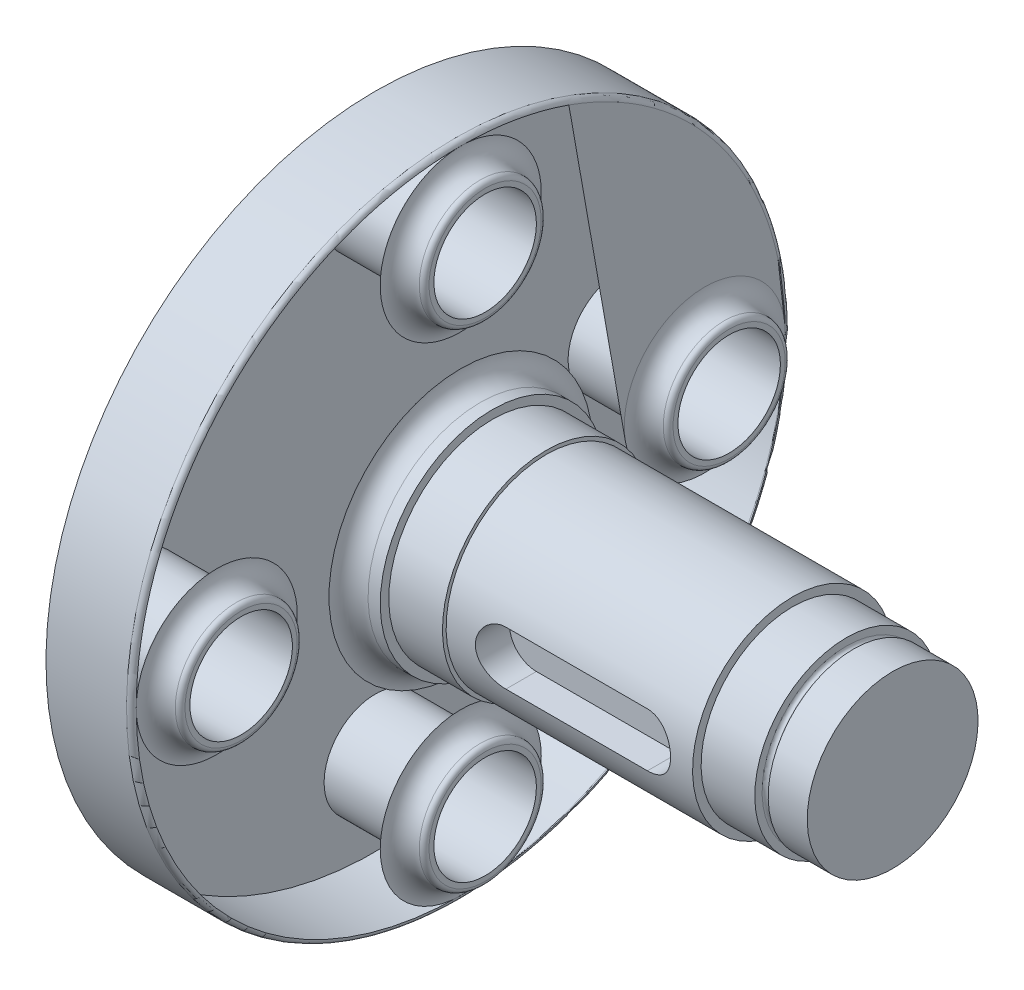
ISO-10303-21;
HEADER;
FILE_DESCRIPTION(('STEP AP214'),'2;1');
FILE_NAME('part.step','',(''),(''),'','','');
FILE_SCHEMA(('AUTOMOTIVE_DESIGN { 1 0 10303 214 1 1 1 1 }'));
ENDSEC;
DATA;
#1=APPLICATION_CONTEXT('core data for automotive mechanical design processes');
#2=APPLICATION_PROTOCOL_DEFINITION('international standard','automotive_design',2000,#1);
#3=PRODUCT_CONTEXT('',#1,'mechanical');
#4=PRODUCT('Part','Part','',(#3));
#5=PRODUCT_RELATED_PRODUCT_CATEGORY('part','',(#4));
#6=PRODUCT_DEFINITION_FORMATION('','',#4);
#7=PRODUCT_DEFINITION_CONTEXT('part definition',#1,'design');
#8=PRODUCT_DEFINITION('design','',#6,#7);
#9=PRODUCT_DEFINITION_SHAPE('','',#8);
#10=(LENGTH_UNIT() NAMED_UNIT(*) SI_UNIT(.MILLI.,.METRE.));
#11=(NAMED_UNIT(*) PLANE_ANGLE_UNIT() SI_UNIT($,.RADIAN.));
#12=(NAMED_UNIT(*) SI_UNIT($,.STERADIAN.) SOLID_ANGLE_UNIT());
#13=UNCERTAINTY_MEASURE_WITH_UNIT(LENGTH_MEASURE(1.E-05),#10,'distance_accuracy_value','');
#14=(GEOMETRIC_REPRESENTATION_CONTEXT(3) GLOBAL_UNCERTAINTY_ASSIGNED_CONTEXT((#13)) GLOBAL_UNIT_ASSIGNED_CONTEXT((#10,
#11,#12)) REPRESENTATION_CONTEXT('',''));
#15=CARTESIAN_POINT('',(0.,0.,0.));
#16=DIRECTION('',(0.,0.,1.));
#17=DIRECTION('',(1.,0.,0.));
#18=AXIS2_PLACEMENT_3D('',#15,#16,#17);
#19=CARTESIAN_POINT('',(333.387398458216,1.76597457780672E-13,0.));
#20=DIRECTION('',(1.,0.,0.));
#21=DIRECTION('',(0.,1.,0.));
#22=AXIS2_PLACEMENT_3D('',#19,#20,#21);
#23=CYLINDRICAL_SURFACE('',#22,40.9999999999999);
#24=CARTESIAN_POINT('',(70.,1.2822271466011E-13,0.));
#25=DIRECTION('',(1.,0.,0.));
#26=DIRECTION('',(0.,1.,0.));
#27=AXIS2_PLACEMENT_3D('',#24,#25,#26);
#28=CIRCLE('',#27,40.9999999999999);
#29=CARTESIAN_POINT('',(70.,41.,0.));
#30=VERTEX_POINT('',#29);
#31=EDGE_CURVE('E321',#30,#30,#28,.T.);
#32=ORIENTED_EDGE('',*,*,#31,.T.);
#33=EDGE_LOOP('',(#32));
#34=FACE_BOUND('',#33,.T.);
#35=CARTESIAN_POINT('',(171.,1.46772763310034E-13,0.));
#36=DIRECTION('',(1.,0.,0.));
#37=DIRECTION('',(0.,1.,0.));
#38=AXIS2_PLACEMENT_3D('',#35,#36,#37);
#39=CIRCLE('',#38,40.9999999999999);
#40=CARTESIAN_POINT('',(171.,41.,0.));
#41=VERTEX_POINT('',#40);
#42=EDGE_CURVE('E323',#41,#41,#39,.T.);
#43=ORIENTED_EDGE('',*,*,#42,.F.);
#44=EDGE_LOOP('',(#43));
#45=FACE_BOUND('',#44,.T.);
#46=DIRECTION('',(1.,0.,0.));
#47=VECTOR('',#46,1.);
#48=CARTESIAN_POINT('',(333.387398458216,-11.,39.4968353162628));
#49=LINE('',#48,#47);
#50=CARTESIAN_POINT('',(93.,-11.,39.4968353162628));
#51=VERTEX_POINT('',#50);
#52=CARTESIAN_POINT('',(151.,-11.,39.4968353162628));
#53=VERTEX_POINT('',#52);
#54=EDGE_CURVE('E129',#51,#53,#49,.T.);
#55=ORIENTED_EDGE('',*,*,#54,.F.);
#56=CARTESIAN_POINT('',(93.,11.,39.4968353162629));
#57=CARTESIAN_POINT('',(92.6965934766001,11.0000393756425,39.4967972893382));
#58=CARTESIAN_POINT('',(92.3932004049759,10.9874487441517,39.5003300911878));
#59=CARTESIAN_POINT('',(91.7886988532549,10.9372977716872,39.5142602703548));
#60=CARTESIAN_POINT('',(91.4875899555039,10.8997421125094,39.5246563605685));
#61=CARTESIAN_POINT('',(90.8904466820825,10.8000593047236,39.5520065632383));
#62=CARTESIAN_POINT('',(90.5944027244958,10.7379855749583,39.5689464166912));
#63=CARTESIAN_POINT('',(90.0088079242076,10.5898053255873,39.6088619348973));
#64=CARTESIAN_POINT('',(89.7192571981718,10.5036983745428,39.6318377080058));
#65=CARTESIAN_POINT('',(89.1487574976311,10.3081921121429,39.6831370091928));
#66=CARTESIAN_POINT('',(88.8678050419883,10.1988023737699,39.711458338845));
#67=CARTESIAN_POINT('',(88.3161318132296,9.95751253351193,39.7726467977459));
#68=CARTESIAN_POINT('',(88.0454149387084,9.82560395793506,39.8055156373071));
#69=CARTESIAN_POINT('',(87.5160861277036,9.54028719155936,39.8748599892475));
#70=CARTESIAN_POINT('',(87.2574728787174,9.386881339139,39.9113351092245));
#71=CARTESIAN_POINT('',(86.7538161899617,9.05954948710992,39.9869076109494));
#72=CARTESIAN_POINT('',(86.5087790431697,8.88561408638734,40.0260061904964));
#73=CARTESIAN_POINT('',(86.0285042179319,8.51425098267137,40.1066632600186));
#74=CARTESIAN_POINT('',(85.7936157615195,8.31637925248789,40.148257459482));
#75=CARTESIAN_POINT('',(85.3413404819344,7.90183501823265,40.2318988347704));
#76=CARTESIAN_POINT('',(85.1239462127466,7.6851705953231,40.2739458091489));
#77=CARTESIAN_POINT('',(84.7078365480413,7.23423794988307,40.3573833919097));
#78=CARTESIAN_POINT('',(84.5091318874403,6.99995974769147,40.3987736118575));
#79=CARTESIAN_POINT('',(84.1319427680088,6.51550217173159,40.4797296453314));
#80=CARTESIAN_POINT('',(83.953450735497,6.26532880910618,40.5192961388913));
#81=CARTESIAN_POINT('',(83.6150778199372,5.74636906421433,40.5961717572341));
#82=CARTESIAN_POINT('',(83.4555517241818,5.47734405395368,40.6334329930268));
#83=CARTESIAN_POINT('',(83.1597918974462,4.92626575670414,40.7039194528673));
#84=CARTESIAN_POINT('',(83.0235584978335,4.64421228444173,40.737144619495));
#85=CARTESIAN_POINT('',(82.7754961547534,4.06909977684511,40.7986033262812));
#86=CARTESIAN_POINT('',(82.6636628441299,3.77604272196828,40.8268377595148));
#87=CARTESIAN_POINT('',(82.4653135588754,3.18099501072235,40.8775050013636));
#88=CARTESIAN_POINT('',(82.3787969003188,2.87900459592939,40.8999379667026));
#89=CARTESIAN_POINT('',(82.2335430435084,2.27541584651143,40.9379016920219));
#90=CARTESIAN_POINT('',(82.1742088894407,1.97397040878766,40.9535802718439));
#91=CARTESIAN_POINT('',(82.0809401507517,1.36690623303855,40.9783337987087));
#92=CARTESIAN_POINT('',(82.0470052120153,1.06128755325691,40.9874088378178));
#93=CARTESIAN_POINT('',(82.0048407553519,0.44819400056801,40.9986964815983));
#94=CARTESIAN_POINT('',(81.9966080152517,0.140719365176638,41.0009099464754));
#95=CARTESIAN_POINT('',(82.0059136918872,-0.473809075616646,40.9984135339345));
#96=CARTESIAN_POINT('',(82.0234517368794,-0.780862887024994,40.9937037563843));
#97=CARTESIAN_POINT('',(82.0833618758795,-1.38442027606809,40.9777035095829));
#98=CARTESIAN_POINT('',(82.1250874355702,-1.68099285156159,40.9665844041265));
#99=CARTESIAN_POINT('',(82.2325022108406,-2.26945953859835,40.9382013285342));
#100=CARTESIAN_POINT('',(82.2981909475589,-2.56135374350881,40.9209374811901));
#101=CARTESIAN_POINT('',(82.4529955305255,-3.13846414067688,40.8807255588915));
#102=CARTESIAN_POINT('',(82.5421119661346,-3.42368016473767,40.8577773409385));
#103=CARTESIAN_POINT('',(82.7430690850665,-3.9855219460573,40.806803256049));
#104=CARTESIAN_POINT('',(82.8549101294878,-4.26214756673236,40.7787773084272));
#105=CARTESIAN_POINT('',(83.1016835471906,-4.80768548456516,40.7180823598488));
#106=CARTESIAN_POINT('',(83.2368323989115,-5.07649504221773,40.6853703674769));
#107=CARTESIAN_POINT('',(83.5285082627457,-5.60188873770017,40.6163646685476));
#108=CARTESIAN_POINT('',(83.6850426580487,-5.85846861188121,40.5800697262108));
#109=CARTESIAN_POINT('',(84.0183643506281,-6.35769629002247,40.5048568335427));
#110=CARTESIAN_POINT('',(84.1951510832411,-6.60034448213445,40.4659389563548));
#111=CARTESIAN_POINT('',(84.5678139869299,-7.07023073722229,40.3864906495515));
#112=CARTESIAN_POINT('',(84.7636905973246,-7.29746844534971,40.3459601828379));
#113=CARTESIAN_POINT('',(85.179674276135,-7.74196490037426,40.263068425597));
#114=CARTESIAN_POINT('',(85.4003461569795,-7.9586921137842,40.2206894381422));
#115=CARTESIAN_POINT('',(85.8591406738117,-8.37278888200139,40.1365300787406));
#116=CARTESIAN_POINT('',(86.0972579952022,-8.57016428967137,40.094749529084));
#117=CARTESIAN_POINT('',(86.5895730428972,-8.94438772318482,40.0129309261099));
#118=CARTESIAN_POINT('',(86.8437781199211,-9.12122625929041,39.9728936836441));
#119=CARTESIAN_POINT('',(87.3665036274435,-9.45301783094547,39.8957325501734));
#120=CARTESIAN_POINT('',(87.6350236128475,-9.60797154641541,39.858608568675));
#121=CARTESIAN_POINT('',(88.186506561747,-9.89584235130244,39.7881192026725));
#122=CARTESIAN_POINT('',(88.4695565783747,-10.0285996033267,39.7547815919242));
#123=CARTESIAN_POINT('',(89.0463961587097,-10.2696993904642,39.6931828752918));
#124=CARTESIAN_POINT('',(89.340185217083,-10.3780430726622,39.6649215309093));
#125=CARTESIAN_POINT('',(89.9360356488008,-10.569290750523,39.6143898036066));
#126=CARTESIAN_POINT('',(90.2380864838329,-10.6522256460243,39.5921121479722));
#127=CARTESIAN_POINT('',(90.8484378001238,-10.7920686165309,39.5542222182512));
#128=CARTESIAN_POINT('',(91.1567353000559,-10.8489888155309,39.5386068394763));
#129=CARTESIAN_POINT('',(91.7209296875923,-10.9283908479877,39.5167268198813));
#130=CARTESIAN_POINT('',(91.9761740314296,-10.9552498398284,39.5092789782629));
#131=CARTESIAN_POINT('',(92.487605360436,-10.9910488481806,39.4993279881873));
#132=CARTESIAN_POINT('',(92.7437902169168,-11.0000171312634,39.4968170397359));
#133=CARTESIAN_POINT('',(93.,-11.,39.4968353162628));
#134=B_SPLINE_CURVE_WITH_KNOTS('',3,(#56,#57,#58,#59,#60,#61,#62,#63,#64,#65,#66,#67,#68,#69,
#70,#71,#72,#73,#74,#75,#76,#77,#78,#79,#80,#81,#82,#83,#84,#85,#86,#87,#88,#89,#90,#91,#92,#93,
#94,#95,#96,#97,#98,#99,#100,#101,#102,#103,#104,#105,#106,#107,#108,#109,#110,#111,#112,#113,
#114,#115,#116,#117,#118,#119,#120,#121,#122,#123,#124,#125,#126,#127,#128,#129,#130,#131,#132,
#133),.UNSPECIFIED.,.F.,.F.,(4,2,2,2,2,2,2,2,2,2,2,2,2,2,2,2,2,2,2,2,2,2,2,2,2,2,2,2,2,2,2,2,2,
2,2,2,2,2,4),(0.,0.909917285293938,1.81966397811948,2.72743939448897,3.63523110808712,
4.54265029136338,5.4504116862655,6.35807441544285,7.26615441590694,8.19486991212238,
9.1231880070085,10.0520360930649,10.9805349795554,11.924320318682,12.8681190832072,
13.8117487867198,14.7553529958611,15.6771037362726,16.5988416254235,17.5204639556483,
18.4420729915999,19.3401143041974,20.2381376720237,21.1361836332127,22.0342438656505,
22.9411448300206,23.8483596897386,24.7555492611899,25.6627597148916,26.5982371026509,
27.5334306812067,28.4690546916543,29.4046496276154,30.3467159308625,31.2887379613846,
32.2296098015472,33.1700427057269,33.9396726741373,34.7080856932821),.UNSPECIFIED.);
#135=CARTESIAN_POINT('',(93.,10.9999999999999,39.4968353162629));
#136=VERTEX_POINT('',#135);
#137=EDGE_CURVE('E109',#136,#51,#134,.T.);
#138=ORIENTED_EDGE('',*,*,#137,.F.);
#139=DIRECTION('',(1.,0.,0.));
#140=VECTOR('',#139,1.);
#141=CARTESIAN_POINT('',(333.387398458216,11.,39.4968353162629));
#142=LINE('',#141,#140);
#143=CARTESIAN_POINT('',(151.,11.,39.4968353162629));
#144=VERTEX_POINT('',#143);
#145=EDGE_CURVE('E121',#144,#136,#142,.F.);
#146=ORIENTED_EDGE('',*,*,#145,.F.);
#147=CARTESIAN_POINT('',(151.,-11.,39.4968353162628));
#148=CARTESIAN_POINT('',(151.3034065234,-11.0000393756425,39.4967972893381));
#149=CARTESIAN_POINT('',(151.606799595024,-10.9874487441517,39.5003300911878));
#150=CARTESIAN_POINT('',(152.211301146745,-10.9372977716872,39.5142602703548));
#151=CARTESIAN_POINT('',(152.512410044496,-10.8997421125094,39.5246563605684));
#152=CARTESIAN_POINT('',(153.109553317918,-10.8000593047236,39.5520065632383));
#153=CARTESIAN_POINT('',(153.405597275504,-10.7379855749583,39.5689464166911));
#154=CARTESIAN_POINT('',(153.991192075792,-10.5898053255873,39.6088619348973));
#155=CARTESIAN_POINT('',(154.280742801828,-10.5036983745428,39.6318377080057));
#156=CARTESIAN_POINT('',(154.851242502369,-10.3081921121429,39.6831370091927));
#157=CARTESIAN_POINT('',(155.132194958012,-10.1988023737699,39.7114583388449));
#158=CARTESIAN_POINT('',(155.68386818677,-9.95751253351194,39.7726467977458));
#159=CARTESIAN_POINT('',(155.954585061292,-9.82560395793508,39.8055156373071));
#160=CARTESIAN_POINT('',(156.483913872296,-9.54028719155938,39.8748599892474));
#161=CARTESIAN_POINT('',(156.742527121283,-9.38688133913902,39.9113351092244));
#162=CARTESIAN_POINT('',(157.246183810038,-9.05954948710993,39.9869076109493));
#163=CARTESIAN_POINT('',(157.49122095683,-8.88561408638736,40.0260061904963));
#164=CARTESIAN_POINT('',(157.971495782068,-8.51425098267139,40.1066632600186));
#165=CARTESIAN_POINT('',(158.206384238481,-8.3163792524879,40.148257459482));
#166=CARTESIAN_POINT('',(158.658659518066,-7.90183501823266,40.2318988347703));
#167=CARTESIAN_POINT('',(158.876053787253,-7.68517059532312,40.2739458091488));
#168=CARTESIAN_POINT('',(159.292163451959,-7.23423794988309,40.3573833919096));
#169=CARTESIAN_POINT('',(159.49086811256,-6.99995974769148,40.3987736118575));
#170=CARTESIAN_POINT('',(159.868057231991,-6.5155021717316,40.4797296453313));
#171=CARTESIAN_POINT('',(160.046549264503,-6.2653288091062,40.5192961388913));
#172=CARTESIAN_POINT('',(160.384922180063,-5.74636906421436,40.596171757234));
#173=CARTESIAN_POINT('',(160.544448275818,-5.4773440539537,40.6334329930268));
#174=CARTESIAN_POINT('',(160.840208102554,-4.92626575670415,40.7039194528673));
#175=CARTESIAN_POINT('',(160.976441502167,-4.64421228444175,40.7371446194949));
#176=CARTESIAN_POINT('',(161.224503845247,-4.06909977684513,40.7986033262811));
#177=CARTESIAN_POINT('',(161.33633715587,-3.77604272196829,40.8268377595148));
#178=CARTESIAN_POINT('',(161.534686441125,-3.18099501072237,40.8775050013636));
#179=CARTESIAN_POINT('',(161.621203099681,-2.8790045959294,40.8999379667025));
#180=CARTESIAN_POINT('',(161.766456956492,-2.27541584651145,40.9379016920219));
#181=CARTESIAN_POINT('',(161.825791110559,-1.97397040878768,40.9535802718439));
#182=CARTESIAN_POINT('',(161.919059849248,-1.36690623303856,40.9783337987087));
#183=CARTESIAN_POINT('',(161.952994787985,-1.06128755325693,40.9874088378178));
#184=CARTESIAN_POINT('',(161.995159244648,-0.448194000568027,40.9986964815983));
#185=CARTESIAN_POINT('',(162.003391984748,-0.140719365176654,41.0009099464754));
#186=CARTESIAN_POINT('',(161.994086308113,0.473809075616631,40.9984135339345));
#187=CARTESIAN_POINT('',(161.976548263121,0.780862887024978,40.9937037563843));
#188=CARTESIAN_POINT('',(161.916638124121,1.38442027606808,40.9777035095829));
#189=CARTESIAN_POINT('',(161.87491256443,1.68099285156159,40.9665844041266));
#190=CARTESIAN_POINT('',(161.767497789159,2.26945953859834,40.9382013285342));
#191=CARTESIAN_POINT('',(161.701809052441,2.56135374350881,40.9209374811901));
#192=CARTESIAN_POINT('',(161.547004469475,3.13846414067688,40.8807255588915));
#193=CARTESIAN_POINT('',(161.457888033865,3.42368016473766,40.8577773409385));
#194=CARTESIAN_POINT('',(161.256930914934,3.98552194605729,40.8068032560491));
#195=CARTESIAN_POINT('',(161.145089870512,4.26214756673235,40.7787773084272));
#196=CARTESIAN_POINT('',(160.898316452809,4.80768548456515,40.7180823598488));
#197=CARTESIAN_POINT('',(160.763167601089,5.07649504221772,40.6853703674769));
#198=CARTESIAN_POINT('',(160.471491737254,5.60188873770015,40.6163646685476));
#199=CARTESIAN_POINT('',(160.314957341951,5.85846861188119,40.5800697262109));
#200=CARTESIAN_POINT('',(159.981635649372,6.35769629002245,40.5048568335428));
#201=CARTESIAN_POINT('',(159.804848916759,6.60034448213443,40.4659389563549));
#202=CARTESIAN_POINT('',(159.43218601307,7.07023073722228,40.3864906495515));
#203=CARTESIAN_POINT('',(159.236309402675,7.2974684453497,40.345960182838));
#204=CARTESIAN_POINT('',(158.820325723865,7.74196490037426,40.263068425597));
#205=CARTESIAN_POINT('',(158.599653843021,7.9586921137842,40.2206894381422));
#206=CARTESIAN_POINT('',(158.140859326188,8.37278888200137,40.1365300787407));
#207=CARTESIAN_POINT('',(157.902742004798,8.57016428967135,40.094749529084));
#208=CARTESIAN_POINT('',(157.410426957103,8.94438772318479,40.01293092611));
#209=CARTESIAN_POINT('',(157.156221880079,9.12122625929038,39.9728936836441));
#210=CARTESIAN_POINT('',(156.633496372557,9.45301783094545,39.8957325501735));
#211=CARTESIAN_POINT('',(156.364976387153,9.6079715464154,39.858608568675));
#212=CARTESIAN_POINT('',(155.813493438253,9.89584235130243,39.7881192026726));
#213=CARTESIAN_POINT('',(155.530443421625,10.0285996033266,39.7547815919243));
#214=CARTESIAN_POINT('',(154.95360384129,10.2696993904642,39.6931828752919));
#215=CARTESIAN_POINT('',(154.659814782917,10.3780430726622,39.6649215309094));
#216=CARTESIAN_POINT('',(154.063964351199,10.5692907505229,39.6143898036067));
#217=CARTESIAN_POINT('',(153.761913516167,10.6522256460243,39.5921121479722));
#218=CARTESIAN_POINT('',(153.151562199876,10.7920686165309,39.5542222182513));
#219=CARTESIAN_POINT('',(152.843264699944,10.8489888155309,39.5386068394763));
#220=CARTESIAN_POINT('',(152.279070312408,10.9283908479877,39.5167268198814));
#221=CARTESIAN_POINT('',(152.02382596857,10.9552498398284,39.509278978263));
#222=CARTESIAN_POINT('',(151.512394639564,10.9910488481806,39.4993279881873));
#223=CARTESIAN_POINT('',(151.256209783083,11.0000171312634,39.496817039736));
#224=CARTESIAN_POINT('',(151.,11.,39.4968353162629));
#225=B_SPLINE_CURVE_WITH_KNOTS('',3,(#147,#148,#149,#150,#151,#152,#153,#154,#155,#156,#157,
#158,#159,#160,#161,#162,#163,#164,#165,#166,#167,#168,#169,#170,#171,#172,#173,#174,#175,#176,
#177,#178,#179,#180,#181,#182,#183,#184,#185,#186,#187,#188,#189,#190,#191,#192,#193,#194,#195,
#196,#197,#198,#199,#200,#201,#202,#203,#204,#205,#206,#207,#208,#209,#210,#211,#212,#213,#214,
#215,#216,#217,#218,#219,#220,#221,#222,#223,#224),.UNSPECIFIED.,.F.,.F.,(4,2,2,2,2,2,2,2,2,2,2,
2,2,2,2,2,2,2,2,2,2,2,2,2,2,2,2,2,2,2,2,2,2,2,2,2,2,2,4),(0.,0.909917285293952,1.81966397811948,
2.72743939448892,3.63523110808711,4.54265029136333,5.45041168626546,6.35807441544281,
7.26615441590692,8.19486991212238,9.12318800700848,10.0520360930649,10.9805349795554,
11.924320318682,12.8681190832072,13.8117487867198,14.7553529958611,15.6771037362726,
16.5988416254235,17.5204639556483,18.4420729915999,19.3401143041974,20.2381376720237,
21.1361836332127,22.0342438656505,22.9411448300206,23.8483596897385,24.7555492611899,
25.6627597148916,26.5982371026508,27.5334306812066,28.4690546916542,29.4046496276154,
30.3467159308624,31.2887379613846,32.2296098015472,33.1700427057268,33.9396726741373,
34.7080856932821),.UNSPECIFIED.);
#226=EDGE_CURVE('E133',#53,#144,#225,.T.);
#227=ORIENTED_EDGE('',*,*,#226,.F.);
#228=EDGE_LOOP('',(#55,#138,#146,#227));
#229=FACE_BOUND('',#228,.T.);
#230=ADVANCED_FACE('F52',(#34,#45,#229),#23,.T.);
#231=CARTESIAN_POINT('',(35.,135.,0.));
#232=DIRECTION('',(1.,0.,0.));
#233=DIRECTION('',(0.,1.,0.));
#234=AXIS2_PLACEMENT_3D('',#231,#232,#233);
#235=PLANE('',#234);
#236=CARTESIAN_POINT('',(35.,100.,0.));
#237=DIRECTION('',(1.,0.,0.));
#238=DIRECTION('',(0.,1.,0.));
#239=AXIS2_PLACEMENT_3D('',#236,#237,#238);
#240=CIRCLE('',#239,33.);
#241=CARTESIAN_POINT('',(35.,133.,0.));
#242=VERTEX_POINT('',#241);
#243=EDGE_CURVE('E296',#242,#242,#240,.F.);
#244=ORIENTED_EDGE('',*,*,#243,.T.);
#245=CARTESIAN_POINT('',(35.,1.21794479979444E-13,0.));
#246=DIRECTION('',(1.,0.,0.));
#247=DIRECTION('',(0.,1.,0.));
#248=AXIS2_PLACEMENT_3D('',#245,#246,#247);
#249=CIRCLE('',#248,133.);
#250=CARTESIAN_POINT('',(35.,1.36145842793048E-12,133.));
#251=VERTEX_POINT('',#250);
#252=EDGE_CURVE('E266',#242,#251,#249,.T.);
#253=ORIENTED_EDGE('',*,*,#252,.T.);
#254=CARTESIAN_POINT('',(35.,1.05387263633361E-12,100.));
#255=DIRECTION('',(1.,0.,0.));
#256=DIRECTION('',(0.,1.,0.));
#257=AXIS2_PLACEMENT_3D('',#254,#255,#256);
#258=CIRCLE('',#257,33.);
#259=EDGE_CURVE('E286',#251,#251,#258,.F.);
#260=ORIENTED_EDGE('',*,*,#259,.T.);
#261=CARTESIAN_POINT('',(35.,1.21794479979444E-13,0.));
#262=DIRECTION('',(1.,0.,0.));
#263=DIRECTION('',(0.,1.,0.));
#264=AXIS2_PLACEMENT_3D('',#261,#262,#263);
#265=CIRCLE('',#264,133.);
#266=CARTESIAN_POINT('',(35.,-133.,0.));
#267=VERTEX_POINT('',#266);
#268=EDGE_CURVE('E269',#251,#267,#265,.T.);
#269=ORIENTED_EDGE('',*,*,#268,.T.);
#270=CARTESIAN_POINT('',(35.,-100.,0.));
#271=DIRECTION('',(1.,0.,0.));
#272=DIRECTION('',(0.,1.,0.));
#273=AXIS2_PLACEMENT_3D('',#270,#271,#272);
#274=CIRCLE('',#273,33.);
#275=EDGE_CURVE('E292',#267,#267,#274,.F.);
#276=ORIENTED_EDGE('',*,*,#275,.T.);
#277=CARTESIAN_POINT('',(35.,1.21794479979444E-13,0.));
#278=DIRECTION('',(1.,0.,0.));
#279=DIRECTION('',(0.,1.,0.));
#280=AXIS2_PLACEMENT_3D('',#277,#278,#279);
#281=CIRCLE('',#280,133.);
#282=CARTESIAN_POINT('',(35.,-4.96009644334067E-13,-133.));
#283=VERTEX_POINT('',#282);
#284=EDGE_CURVE('E72',#267,#283,#281,.T.);
#285=ORIENTED_EDGE('',*,*,#284,.T.);
#286=CARTESIAN_POINT('',(35.,-3.42719899203647E-13,-100.));
#287=DIRECTION('',(1.,0.,0.));
#288=DIRECTION('',(0.,1.,0.));
#289=AXIS2_PLACEMENT_3D('',#286,#287,#288);
#290=CIRCLE('',#289,33.);
#291=EDGE_CURVE('E294',#283,#283,#290,.F.);
#292=ORIENTED_EDGE('',*,*,#291,.T.);
#293=CARTESIAN_POINT('',(35.,1.21794479979444E-13,0.));
#294=DIRECTION('',(1.,0.,0.));
#295=DIRECTION('',(0.,1.,0.));
#296=AXIS2_PLACEMENT_3D('',#293,#294,#295);
#297=CIRCLE('',#296,133.);
#298=EDGE_CURVE('E67',#283,#242,#297,.T.);
#299=ORIENTED_EDGE('',*,*,#298,.T.);
#300=EDGE_LOOP('',(#244,#253,#260,#269,#276,#285,#292,#299));
#301=FACE_BOUND('',#300,.T.);
#302=CARTESIAN_POINT('',(35.,1.21794479979444E-13,0.));
#303=DIRECTION('',(1.,0.,0.));
#304=DIRECTION('',(0.,1.,0.));
#305=AXIS2_PLACEMENT_3D('',#302,#303,#304);
#306=CIRCLE('',#305,53.9999999999998);
#307=CARTESIAN_POINT('',(35.,54.,0.));
#308=VERTEX_POINT('',#307);
#309=EDGE_CURVE('E289',#308,#308,#306,.F.);
#310=ORIENTED_EDGE('',*,*,#309,.T.);
#311=EDGE_LOOP('',(#310));
#312=FACE_BOUND('',#311,.T.);
#313=ADVANCED_FACE('F169',(#301,#312),#235,.T.);
#314=CARTESIAN_POINT('',(0.,0.,0.));
#315=DIRECTION('',(-1.,0.,0.));
#316=DIRECTION('',(0.,-1.,0.));
#317=AXIS2_PLACEMENT_3D('',#314,#315,#316);
#318=PLANE('',#317);
#319=CARTESIAN_POINT('',(0.,-3.49148133884313E-13,-100.));
#320=DIRECTION('',(-1.,0.,0.));
#321=DIRECTION('',(0.,-1.,0.));
#322=AXIS2_PLACEMENT_3D('',#319,#320,#321);
#323=CIRCLE('',#322,21.);
#324=CARTESIAN_POINT('',(0.,-21.0000000000003,-100.));
#325=VERTEX_POINT('',#324);
#326=EDGE_CURVE('E344',#325,#325,#323,.F.);
#327=ORIENTED_EDGE('',*,*,#326,.T.);
#328=EDGE_LOOP('',(#327));
#329=FACE_BOUND('',#328,.T.);
#330=CARTESIAN_POINT('',(0.,-100.,0.));
#331=DIRECTION('',(-1.,0.,0.));
#332=DIRECTION('',(0.,-1.,0.));
#333=AXIS2_PLACEMENT_3D('',#330,#331,#332);
#334=CIRCLE('',#333,21.);
#335=CARTESIAN_POINT('',(0.,-121.,0.));
#336=VERTEX_POINT('',#335);
#337=EDGE_CURVE('E348',#336,#336,#334,.F.);
#338=ORIENTED_EDGE('',*,*,#337,.T.);
#339=EDGE_LOOP('',(#338));
#340=FACE_BOUND('',#339,.T.);
#341=CARTESIAN_POINT('',(0.,1.04744440165294E-12,100.));
#342=DIRECTION('',(-1.,0.,0.));
#343=DIRECTION('',(0.,-1.,0.));
#344=AXIS2_PLACEMENT_3D('',#341,#342,#343);
#345=CIRCLE('',#344,21.);
#346=CARTESIAN_POINT('',(0.,-20.9999999999989,100.));
#347=VERTEX_POINT('',#346);
#348=EDGE_CURVE('E345',#347,#347,#345,.F.);
#349=ORIENTED_EDGE('',*,*,#348,.T.);
#350=EDGE_LOOP('',(#349));
#351=FACE_BOUND('',#350,.T.);
#352=CARTESIAN_POINT('',(0.,100.,0.));
#353=DIRECTION('',(-1.,0.,0.));
#354=DIRECTION('',(0.,-1.,0.));
#355=AXIS2_PLACEMENT_3D('',#352,#353,#354);
#356=CIRCLE('',#355,21.);
#357=CARTESIAN_POINT('',(0.,79.,0.));
#358=VERTEX_POINT('',#357);
#359=EDGE_CURVE('E338',#358,#358,#356,.F.);
#360=ORIENTED_EDGE('',*,*,#359,.T.);
#361=EDGE_LOOP('',(#360));
#362=FACE_BOUND('',#361,.T.);
#363=CARTESIAN_POINT('',(0.,1.15366245298777E-13,0.));
#364=DIRECTION('',(1.,0.,0.));
#365=DIRECTION('',(0.,1.,0.));
#366=AXIS2_PLACEMENT_3D('',#363,#364,#365);
#367=CIRCLE('',#366,135.);
#368=CARTESIAN_POINT('',(0.,135.,0.));
#369=VERTEX_POINT('',#368);
#370=EDGE_CURVE('E309',#369,#369,#367,.T.);
#371=ORIENTED_EDGE('',*,*,#370,.F.);
#372=EDGE_LOOP('',(#371));
#373=FACE_BOUND('',#372,.T.);
#374=ADVANCED_FACE('F175',(#329,#340,#351,#362,#373),#318,.T.);
#375=CARTESIAN_POINT('',(333.387398458216,1.76597457780672E-13,0.));
#376=DIRECTION('',(1.,0.,0.));
#377=DIRECTION('',(0.,1.,0.));
#378=AXIS2_PLACEMENT_3D('',#375,#376,#377);
#379=CYLINDRICAL_SURFACE('',#378,135.);
#380=CARTESIAN_POINT('',(33.,1.21427152283406E-13,0.));
#381=DIRECTION('',(1.,0.,0.));
#382=DIRECTION('',(0.,1.,0.));
#383=AXIS2_PLACEMENT_3D('',#380,#381,#382);
#384=CIRCLE('',#383,135.);
#385=CARTESIAN_POINT('',(32.9999999999999,135.,0.));
#386=VERTEX_POINT('',#385);
#387=EDGE_CURVE('E261',#386,#386,#384,.F.);
#388=ORIENTED_EDGE('',*,*,#387,.T.);
#389=EDGE_LOOP('',(#388));
#390=FACE_BOUND('',#389,.T.);
#391=ORIENTED_EDGE('',*,*,#370,.T.);
#392=EDGE_LOOP('',(#391));
#393=FACE_BOUND('',#392,.T.);
#394=ADVANCED_FACE('F197',(#390,#393),#379,.T.);
#395=CARTESIAN_POINT('',(333.387398458216,1.76597457780672E-13,0.));
#396=DIRECTION('',(1.,0.,0.));
#397=DIRECTION('',(0.,1.,0.));
#398=AXIS2_PLACEMENT_3D('',#395,#396,#397);
#399=CYLINDRICAL_SURFACE('',#398,45.9999999999998);
#400=CARTESIAN_POINT('',(43.,1.23263790763596E-13,0.));
#401=DIRECTION('',(1.,0.,0.));
#402=DIRECTION('',(0.,1.,0.));
#403=AXIS2_PLACEMENT_3D('',#400,#401,#402);
#404=CIRCLE('',#403,45.9999999999998);
#405=CARTESIAN_POINT('',(43.,46.,0.));
#406=VERTEX_POINT('',#405);
#407=EDGE_CURVE('E283',#406,#406,#404,.T.);
#408=ORIENTED_EDGE('',*,*,#407,.T.);
#409=EDGE_LOOP('',(#408));
#410=FACE_BOUND('',#409,.T.);
#411=CARTESIAN_POINT('',(48.,1.24182110003691E-13,0.));
#412=DIRECTION('',(1.,0.,0.));
#413=DIRECTION('',(0.,1.,0.));
#414=AXIS2_PLACEMENT_3D('',#411,#412,#413);
#415=CIRCLE('',#414,45.9999999999998);
#416=CARTESIAN_POINT('',(48.,46.,0.));
#417=VERTEX_POINT('',#416);
#418=EDGE_CURVE('E312',#417,#417,#415,.T.);
#419=ORIENTED_EDGE('',*,*,#418,.F.);
#420=EDGE_LOOP('',(#419));
#421=FACE_BOUND('',#420,.T.);
#422=ADVANCED_FACE('F194',(#410,#421),#399,.T.);
#423=CARTESIAN_POINT('',(48.,46.,0.));
#424=DIRECTION('',(1.,0.,0.));
#425=DIRECTION('',(0.,1.,0.));
#426=AXIS2_PLACEMENT_3D('',#423,#424,#425);
#427=PLANE('',#426);
#428=ORIENTED_EDGE('',*,*,#418,.T.);
#429=EDGE_LOOP('',(#428));
#430=FACE_BOUND('',#429,.T.);
#431=CARTESIAN_POINT('',(48.,1.24182110003691E-13,0.));
#432=DIRECTION('',(1.,0.,0.));
#433=DIRECTION('',(0.,1.,0.));
#434=AXIS2_PLACEMENT_3D('',#431,#432,#433);
#435=CIRCLE('',#434,42.4999999999999);
#436=CARTESIAN_POINT('',(48.,42.5,0.));
#437=VERTEX_POINT('',#436);
#438=EDGE_CURVE('E315',#437,#437,#435,.T.);
#439=ORIENTED_EDGE('',*,*,#438,.F.);
#440=EDGE_LOOP('',(#439));
#441=FACE_BOUND('',#440,.T.);
#442=ADVANCED_FACE('F190',(#430,#441),#427,.T.);
#443=CARTESIAN_POINT('',(333.387398458216,1.76597457780672E-13,0.));
#444=DIRECTION('',(1.,0.,0.));
#445=DIRECTION('',(0.,1.,0.));
#446=AXIS2_PLACEMENT_3D('',#443,#444,#445);
#447=CYLINDRICAL_SURFACE('',#446,42.4999999999998);
#448=ORIENTED_EDGE('',*,*,#438,.T.);
#449=EDGE_LOOP('',(#448));
#450=FACE_BOUND('',#449,.T.);
#451=CARTESIAN_POINT('',(70.,1.2822271466011E-13,0.));
#452=DIRECTION('',(1.,0.,0.));
#453=DIRECTION('',(0.,1.,0.));
#454=AXIS2_PLACEMENT_3D('',#451,#452,#453);
#455=CIRCLE('',#454,42.4999999999999);
#456=CARTESIAN_POINT('',(70.,42.5,0.));
#457=VERTEX_POINT('',#456);
#458=EDGE_CURVE('E318',#457,#457,#455,.T.);
#459=ORIENTED_EDGE('',*,*,#458,.F.);
#460=EDGE_LOOP('',(#459));
#461=FACE_BOUND('',#460,.T.);
#462=ADVANCED_FACE('F186',(#450,#461),#447,.T.);
#463=CARTESIAN_POINT('',(70.,42.5,0.));
#464=DIRECTION('',(1.,0.,0.));
#465=DIRECTION('',(0.,1.,0.));
#466=AXIS2_PLACEMENT_3D('',#463,#464,#465);
#467=PLANE('',#466);
#468=ORIENTED_EDGE('',*,*,#458,.T.);
#469=EDGE_LOOP('',(#468));
#470=FACE_BOUND('',#469,.T.);
#471=ORIENTED_EDGE('',*,*,#31,.F.);
#472=EDGE_LOOP('',(#471));
#473=FACE_BOUND('',#472,.T.);
#474=ADVANCED_FACE('F183',(#470,#473),#467,.T.);
#475=CARTESIAN_POINT('',(171.,41.,0.));
#476=DIRECTION('',(1.,0.,0.));
#477=DIRECTION('',(0.,1.,0.));
#478=AXIS2_PLACEMENT_3D('',#475,#476,#477);
#479=PLANE('',#478);
#480=ORIENTED_EDGE('',*,*,#42,.T.);
#481=EDGE_LOOP('',(#480));
#482=FACE_BOUND('',#481,.T.);
#483=CARTESIAN_POINT('',(171.,1.46772763310034E-13,0.));
#484=DIRECTION('',(1.,0.,0.));
#485=DIRECTION('',(0.,1.,0.));
#486=AXIS2_PLACEMENT_3D('',#483,#484,#485);
#487=CIRCLE('',#486,37.4999999999998);
#488=CARTESIAN_POINT('',(171.,37.5,0.));
#489=VERTEX_POINT('',#488);
#490=EDGE_CURVE('E326',#489,#489,#487,.T.);
#491=ORIENTED_EDGE('',*,*,#490,.F.);
#492=EDGE_LOOP('',(#491));
#493=FACE_BOUND('',#492,.T.);
#494=ADVANCED_FACE('F181',(#482,#493),#479,.T.);
#495=CARTESIAN_POINT('',(333.387398458216,1.76597457780672E-13,0.));
#496=DIRECTION('',(1.,0.,0.));
#497=DIRECTION('',(0.,1.,0.));
#498=AXIS2_PLACEMENT_3D('',#495,#496,#497);
#499=CYLINDRICAL_SURFACE('',#498,37.4999999999998);
#500=ORIENTED_EDGE('',*,*,#490,.T.);
#501=EDGE_LOOP('',(#500));
#502=FACE_BOUND('',#501,.T.);
#503=CARTESIAN_POINT('',(193.,1.50813367966453E-13,0.));
#504=DIRECTION('',(1.,0.,0.));
#505=DIRECTION('',(0.,1.,0.));
#506=AXIS2_PLACEMENT_3D('',#503,#504,#505);
#507=CIRCLE('',#506,37.4999999999998);
#508=CARTESIAN_POINT('',(193.,37.5,0.));
#509=VERTEX_POINT('',#508);
#510=EDGE_CURVE('E329',#509,#509,#507,.T.);
#511=ORIENTED_EDGE('',*,*,#510,.F.);
#512=EDGE_LOOP('',(#511));
#513=FACE_BOUND('',#512,.T.);
#514=ADVANCED_FACE('F492',(#502,#513),#499,.T.);
#515=CARTESIAN_POINT('',(193.,37.5,0.));
#516=DIRECTION('',(1.,0.,0.));
#517=DIRECTION('',(0.,1.,0.));
#518=AXIS2_PLACEMENT_3D('',#515,#516,#517);
#519=PLANE('',#518);
#520=CARTESIAN_POINT('',(193.,1.50813367966453E-13,0.));
#521=DIRECTION('',(1.,0.,0.));
#522=DIRECTION('',(0.,1.,0.));
#523=AXIS2_PLACEMENT_3D('',#520,#521,#522);
#524=CIRCLE('',#523,34.4999999999998);
#525=CARTESIAN_POINT('',(193.,34.5,0.));
#526=VERTEX_POINT('',#525);
#527=EDGE_CURVE('E301',#526,#526,#524,.F.);
#528=ORIENTED_EDGE('',*,*,#527,.T.);
#529=EDGE_LOOP('',(#528));
#530=FACE_BOUND('',#529,.T.);
#531=ORIENTED_EDGE('',*,*,#510,.T.);
#532=EDGE_LOOP('',(#531));
#533=FACE_BOUND('',#532,.T.);
#534=ADVANCED_FACE('F497',(#530,#533),#519,.T.);
#535=CARTESIAN_POINT('',(196.,33.,0.));
#536=DIRECTION('',(-1.,0.,0.));
#537=DIRECTION('',(0.,-1.,0.));
#538=AXIS2_PLACEMENT_3D('',#535,#536,#537);
#539=PLANE('',#538);
#540=CARTESIAN_POINT('',(196.,1.5136435951051E-13,0.));
#541=DIRECTION('',(-1.,0.,0.));
#542=DIRECTION('',(0.,-1.,0.));
#543=AXIS2_PLACEMENT_3D('',#540,#541,#542);
#544=CIRCLE('',#543,34.4999999999998);
#545=CARTESIAN_POINT('',(196.,-34.4999999999997,0.));
#546=VERTEX_POINT('',#545);
#547=EDGE_CURVE('E306',#546,#546,#544,.F.);
#548=ORIENTED_EDGE('',*,*,#547,.T.);
#549=EDGE_LOOP('',(#548));
#550=FACE_BOUND('',#549,.T.);
#551=CARTESIAN_POINT('',(196.,1.5136435951051E-13,0.));
#552=DIRECTION('',(1.,0.,0.));
#553=DIRECTION('',(0.,1.,0.));
#554=AXIS2_PLACEMENT_3D('',#551,#552,#553);
#555=CIRCLE('',#554,34.9999999999998);
#556=CARTESIAN_POINT('',(196.,35.,0.));
#557=VERTEX_POINT('',#556);
#558=EDGE_CURVE('E332',#557,#557,#555,.T.);
#559=ORIENTED_EDGE('',*,*,#558,.F.);
#560=EDGE_LOOP('',(#559));
#561=FACE_BOUND('',#560,.T.);
#562=ADVANCED_FACE('F484',(#550,#561),#539,.T.);
#563=CARTESIAN_POINT('',(333.387398458216,1.76597457780672E-13,0.));
#564=DIRECTION('',(1.,0.,0.));
#565=DIRECTION('',(0.,1.,0.));
#566=AXIS2_PLACEMENT_3D('',#563,#564,#565);
#567=CYLINDRICAL_SURFACE('',#566,34.9999999999998);
#568=ORIENTED_EDGE('',*,*,#558,.T.);
#569=EDGE_LOOP('',(#568));
#570=FACE_BOUND('',#569,.T.);
#571=CARTESIAN_POINT('',(212.,1.54302981078815E-13,0.));
#572=DIRECTION('',(1.,0.,0.));
#573=DIRECTION('',(0.,1.,0.));
#574=AXIS2_PLACEMENT_3D('',#571,#572,#573);
#575=CIRCLE('',#574,34.9999999999998);
#576=CARTESIAN_POINT('',(212.,35.,0.));
#577=VERTEX_POINT('',#576);
#578=EDGE_CURVE('E335',#577,#577,#575,.T.);
#579=ORIENTED_EDGE('',*,*,#578,.F.);
#580=EDGE_LOOP('',(#579));
#581=FACE_BOUND('',#580,.T.);
#582=ADVANCED_FACE('F471',(#570,#581),#567,.T.);
#583=CARTESIAN_POINT('',(212.,35.,0.));
#584=DIRECTION('',(1.,0.,0.));
#585=DIRECTION('',(0.,1.,0.));
#586=AXIS2_PLACEMENT_3D('',#583,#584,#585);
#587=PLANE('',#586);
#588=ORIENTED_EDGE('',*,*,#578,.T.);
#589=EDGE_LOOP('',(#588));
#590=FACE_BOUND('',#589,.T.);
#591=ADVANCED_FACE('F458',(#590),#587,.T.);
#592=CARTESIAN_POINT('',(-0.00100000000006345,100.,0.));
#593=DIRECTION('',(1.,0.,0.));
#594=DIRECTION('',(0.,1.,0.));
#595=AXIS2_PLACEMENT_3D('',#592,#593,#594);
#596=CYLINDRICAL_SURFACE('',#595,21.);
#597=ORIENTED_EDGE('',*,*,#359,.F.);
#598=EDGE_LOOP('',(#597));
#599=FACE_BOUND('',#598,.T.);
#600=CARTESIAN_POINT('',(45.,100.,0.));
#601=DIRECTION('',(1.,0.,0.));
#602=DIRECTION('',(0.,1.,0.));
#603=AXIS2_PLACEMENT_3D('',#600,#601,#602);
#604=CIRCLE('',#603,21.);
#605=CARTESIAN_POINT('',(45.,121.,0.));
#606=VERTEX_POINT('',#605);
#607=EDGE_CURVE('E341',#606,#606,#604,.T.);
#608=ORIENTED_EDGE('',*,*,#607,.T.);
#609=EDGE_LOOP('',(#608));
#610=FACE_BOUND('',#609,.T.);
#611=ADVANCED_FACE('F453',(#599,#610),#596,.F.);
#612=CARTESIAN_POINT('',(45.,100.,0.));
#613=DIRECTION('',(1.,0.,0.));
#614=DIRECTION('',(0.,1.,0.));
#615=AXIS2_PLACEMENT_3D('',#612,#613,#614);
#616=PLANE('',#615);
#617=CARTESIAN_POINT('',(45.,100.,0.));
#618=DIRECTION('',(1.,0.,0.));
#619=DIRECTION('',(0.,1.,0.));
#620=AXIS2_PLACEMENT_3D('',#617,#618,#619);
#621=CIRCLE('',#620,23.);
#622=CARTESIAN_POINT('',(45.,123.,0.));
#623=VERTEX_POINT('',#622);
#624=EDGE_CURVE('E259',#623,#623,#621,.T.);
#625=ORIENTED_EDGE('',*,*,#624,.T.);
#626=EDGE_LOOP('',(#625));
#627=FACE_BOUND('',#626,.T.);
#628=ORIENTED_EDGE('',*,*,#607,.F.);
#629=EDGE_LOOP('',(#628));
#630=FACE_BOUND('',#629,.T.);
#631=ADVANCED_FACE('F436',(#627,#630),#616,.T.);
#632=CARTESIAN_POINT('',(-0.00100000000004957,1.04744421798909E-12,100.));
#633=DIRECTION('',(1.,0.,0.));
#634=DIRECTION('',(0.,1.,0.));
#635=AXIS2_PLACEMENT_3D('',#632,#633,#634);
#636=CYLINDRICAL_SURFACE('',#635,21.);
#637=ORIENTED_EDGE('',*,*,#348,.F.);
#638=EDGE_LOOP('',(#637));
#639=FACE_BOUND('',#638,.T.);
#640=CARTESIAN_POINT('',(45.,1.0557092748138E-12,100.));
#641=DIRECTION('',(1.,0.,0.));
#642=DIRECTION('',(0.,0.,1.));
#643=AXIS2_PLACEMENT_3D('',#640,#641,#642);
#644=CIRCLE('',#643,21.);
#645=CARTESIAN_POINT('',(45.,1.27567259916091E-12,121.));
#646=VERTEX_POINT('',#645);
#647=EDGE_CURVE('E125',#646,#646,#644,.T.);
#648=ORIENTED_EDGE('',*,*,#647,.T.);
#649=EDGE_LOOP('',(#648));
#650=FACE_BOUND('',#649,.T.);
#651=ADVANCED_FACE('F425',(#639,#650),#636,.F.);
#652=CARTESIAN_POINT('',(-0.00100000000002876,-100.,0.));
#653=DIRECTION('',(1.,0.,0.));
#654=DIRECTION('',(0.,1.,0.));
#655=AXIS2_PLACEMENT_3D('',#652,#653,#654);
#656=CYLINDRICAL_SURFACE('',#655,21.);
#657=ORIENTED_EDGE('',*,*,#337,.F.);
#658=EDGE_LOOP('',(#657));
#659=FACE_BOUND('',#658,.T.);
#660=CARTESIAN_POINT('',(45.,-100.,0.));
#661=DIRECTION('',(1.,0.,0.));
#662=DIRECTION('',(0.,-1.,0.));
#663=AXIS2_PLACEMENT_3D('',#660,#661,#662);
#664=CIRCLE('',#663,21.);
#665=CARTESIAN_POINT('',(45.,-121.,0.));
#666=VERTEX_POINT('',#665);
#667=EDGE_CURVE('E356',#666,#666,#664,.T.);
#668=ORIENTED_EDGE('',*,*,#667,.T.);
#669=EDGE_LOOP('',(#668));
#670=FACE_BOUND('',#669,.T.);
#671=ADVANCED_FACE('F412',(#659,#670),#656,.F.);
#672=CARTESIAN_POINT('',(-0.00100000000004957,-3.49148317548161E-13,-100.));
#673=DIRECTION('',(1.,0.,0.));
#674=DIRECTION('',(0.,1.,0.));
#675=AXIS2_PLACEMENT_3D('',#672,#673,#674);
#676=CYLINDRICAL_SURFACE('',#675,21.);
#677=ORIENTED_EDGE('',*,*,#326,.F.);
#678=EDGE_LOOP('',(#677));
#679=FACE_BOUND('',#678,.T.);
#680=CARTESIAN_POINT('',(45.,-3.40883260723456E-13,-100.));
#681=DIRECTION('',(1.,0.,0.));
#682=DIRECTION('',(0.,0.,-1.));
#683=AXIS2_PLACEMENT_3D('',#680,#681,#682);
#684=CIRCLE('',#683,21.);
#685=CARTESIAN_POINT('',(45.,-4.14204368839162E-13,-121.));
#686=VERTEX_POINT('',#685);
#687=EDGE_CURVE('E349',#686,#686,#684,.T.);
#688=ORIENTED_EDGE('',*,*,#687,.T.);
#689=EDGE_LOOP('',(#688));
#690=FACE_BOUND('',#689,.T.);
#691=ADVANCED_FACE('F406',(#679,#690),#676,.F.);
#692=CARTESIAN_POINT('',(45.,-3.40883260723456E-13,-100.));
#693=DIRECTION('',(1.,0.,0.));
#694=DIRECTION('',(0.,0.,-1.));
#695=AXIS2_PLACEMENT_3D('',#692,#693,#694);
#696=PLANE('',#695);
#697=CARTESIAN_POINT('',(45.,-3.40883260723456E-13,-100.));
#698=DIRECTION('',(1.,0.,0.));
#699=DIRECTION('',(0.,1.,0.));
#700=AXIS2_PLACEMENT_3D('',#697,#698,#699);
#701=CIRCLE('',#700,23.);
#702=CARTESIAN_POINT('',(45.,22.9999999999997,-100.));
#703=VERTEX_POINT('',#702);
#704=EDGE_CURVE('E13',#703,#703,#701,.T.);
#705=ORIENTED_EDGE('',*,*,#704,.T.);
#706=EDGE_LOOP('',(#705));
#707=FACE_BOUND('',#706,.T.);
#708=ORIENTED_EDGE('',*,*,#687,.F.);
#709=EDGE_LOOP('',(#708));
#710=FACE_BOUND('',#709,.T.);
#711=ADVANCED_FACE('F411',(#707,#710),#696,.T.);
#712=CARTESIAN_POINT('',(45.,-100.,0.));
#713=DIRECTION('',(1.,0.,0.));
#714=DIRECTION('',(0.,-1.,0.));
#715=AXIS2_PLACEMENT_3D('',#712,#713,#714);
#716=PLANE('',#715);
#717=CARTESIAN_POINT('',(45.,-100.,0.));
#718=DIRECTION('',(1.,0.,0.));
#719=DIRECTION('',(0.,1.,0.));
#720=AXIS2_PLACEMENT_3D('',#717,#718,#719);
#721=CIRCLE('',#720,23.);
#722=CARTESIAN_POINT('',(45.,-77.,0.));
#723=VERTEX_POINT('',#722);
#724=EDGE_CURVE('E60',#723,#723,#721,.T.);
#725=ORIENTED_EDGE('',*,*,#724,.T.);
#726=EDGE_LOOP('',(#725));
#727=FACE_BOUND('',#726,.T.);
#728=ORIENTED_EDGE('',*,*,#667,.F.);
#729=EDGE_LOOP('',(#728));
#730=FACE_BOUND('',#729,.T.);
#731=ADVANCED_FACE('F559',(#727,#730),#716,.T.);
#732=CARTESIAN_POINT('',(45.,1.0557092748138E-12,100.));
#733=DIRECTION('',(1.,0.,0.));
#734=DIRECTION('',(0.,0.,1.));
#735=AXIS2_PLACEMENT_3D('',#732,#733,#734);
#736=PLANE('',#735);
#737=CARTESIAN_POINT('',(45.,1.0557092748138E-12,100.));
#738=DIRECTION('',(1.,0.,0.));
#739=DIRECTION('',(0.,1.,0.));
#740=AXIS2_PLACEMENT_3D('',#737,#738,#739);
#741=CIRCLE('',#740,23.);
#742=CARTESIAN_POINT('',(45.,23.0000000000011,100.));
#743=VERTEX_POINT('',#742);
#744=EDGE_CURVE('E273',#743,#743,#741,.T.);
#745=ORIENTED_EDGE('',*,*,#744,.T.);
#746=EDGE_LOOP('',(#745));
#747=FACE_BOUND('',#746,.T.);
#748=ORIENTED_EDGE('',*,*,#647,.F.);
#749=EDGE_LOOP('',(#748));
#750=FACE_BOUND('',#749,.T.);
#751=ADVANCED_FACE('F167',(#747,#750),#736,.T.);
#752=CARTESIAN_POINT('',(93.,0.,135.001));
#753=DIRECTION('',(0.,0.,-1.));
#754=DIRECTION('',(-1.,0.,0.));
#755=AXIS2_PLACEMENT_3D('',#752,#753,#754);
#756=CYLINDRICAL_SURFACE('',#755,11.);
#757=ORIENTED_EDGE('',*,*,#137,.T.);
#758=DIRECTION('',(0.,0.,-1.));
#759=VECTOR('',#758,1.);
#760=CARTESIAN_POINT('',(93.,-11.,135.001));
#761=LINE('',#760,#759);
#762=CARTESIAN_POINT('',(93.,-11.,27.));
#763=VERTEX_POINT('',#762);
#764=EDGE_CURVE('E126',#51,#763,#761,.T.);
#765=ORIENTED_EDGE('',*,*,#764,.T.);
#766=CARTESIAN_POINT('',(93.,0.,27.));
#767=DIRECTION('',(0.,0.,1.));
#768=DIRECTION('',(1.,0.,0.));
#769=AXIS2_PLACEMENT_3D('',#766,#767,#768);
#770=CIRCLE('',#769,11.);
#771=CARTESIAN_POINT('',(93.,11.,27.));
#772=VERTEX_POINT('',#771);
#773=EDGE_CURVE('E112',#772,#763,#770,.T.);
#774=ORIENTED_EDGE('',*,*,#773,.F.);
#775=DIRECTION('',(0.,0.,-1.));
#776=VECTOR('',#775,1.);
#777=CARTESIAN_POINT('',(93.,11.,135.001));
#778=LINE('',#777,#776);
#779=EDGE_CURVE('E105',#136,#772,#778,.T.);
#780=ORIENTED_EDGE('',*,*,#779,.F.);
#781=EDGE_LOOP('',(#757,#765,#774,#780));
#782=FACE_BOUND('',#781,.T.);
#783=ADVANCED_FACE('F107',(#782),#756,.F.);
#784=CARTESIAN_POINT('',(93.,-11.,135.001));
#785=DIRECTION('',(0.,1.,0.));
#786=DIRECTION('',(-1.,0.,0.));
#787=AXIS2_PLACEMENT_3D('',#784,#785,#786);
#788=PLANE('',#787);
#789=ORIENTED_EDGE('',*,*,#54,.T.);
#790=DIRECTION('',(0.,0.,-1.));
#791=VECTOR('',#790,1.);
#792=CARTESIAN_POINT('',(151.,-11.,135.001));
#793=LINE('',#792,#791);
#794=CARTESIAN_POINT('',(151.,-11.,27.));
#795=VERTEX_POINT('',#794);
#796=EDGE_CURVE('E362',#53,#795,#793,.T.);
#797=ORIENTED_EDGE('',*,*,#796,.T.);
#798=DIRECTION('',(1.,0.,0.));
#799=VECTOR('',#798,1.);
#800=CARTESIAN_POINT('',(93.,-11.,27.));
#801=LINE('',#800,#799);
#802=EDGE_CURVE('E131',#763,#795,#801,.T.);
#803=ORIENTED_EDGE('',*,*,#802,.F.);
#804=ORIENTED_EDGE('',*,*,#764,.F.);
#805=EDGE_LOOP('',(#789,#797,#803,#804));
#806=FACE_BOUND('',#805,.T.);
#807=ADVANCED_FACE('F160',(#806),#788,.T.);
#808=CARTESIAN_POINT('',(151.,0.,135.001));
#809=DIRECTION('',(0.,0.,-1.));
#810=DIRECTION('',(-1.,0.,0.));
#811=AXIS2_PLACEMENT_3D('',#808,#809,#810);
#812=CYLINDRICAL_SURFACE('',#811,11.);
#813=ORIENTED_EDGE('',*,*,#226,.T.);
#814=DIRECTION('',(0.,0.,-1.));
#815=VECTOR('',#814,1.);
#816=CARTESIAN_POINT('',(151.,11.,135.001));
#817=LINE('',#816,#815);
#818=CARTESIAN_POINT('',(151.,11.,27.));
#819=VERTEX_POINT('',#818);
#820=EDGE_CURVE('E116',#144,#819,#817,.T.);
#821=ORIENTED_EDGE('',*,*,#820,.T.);
#822=CARTESIAN_POINT('',(151.,0.,27.));
#823=DIRECTION('',(0.,0.,1.));
#824=DIRECTION('',(1.,0.,0.));
#825=AXIS2_PLACEMENT_3D('',#822,#823,#824);
#826=CIRCLE('',#825,11.);
#827=EDGE_CURVE('E366',#795,#819,#826,.T.);
#828=ORIENTED_EDGE('',*,*,#827,.F.);
#829=ORIENTED_EDGE('',*,*,#796,.F.);
#830=EDGE_LOOP('',(#813,#821,#828,#829));
#831=FACE_BOUND('',#830,.T.);
#832=ADVANCED_FACE('F157',(#831),#812,.F.);
#833=CARTESIAN_POINT('',(93.,11.,135.001));
#834=DIRECTION('',(0.,-1.,0.));
#835=DIRECTION('',(1.,0.,0.));
#836=AXIS2_PLACEMENT_3D('',#833,#834,#835);
#837=PLANE('',#836);
#838=ORIENTED_EDGE('',*,*,#145,.T.);
#839=ORIENTED_EDGE('',*,*,#779,.T.);
#840=DIRECTION('',(-1.,0.,0.));
#841=VECTOR('',#840,1.);
#842=CARTESIAN_POINT('',(93.,11.,27.));
#843=LINE('',#842,#841);
#844=EDGE_CURVE('E117',#819,#772,#843,.T.);
#845=ORIENTED_EDGE('',*,*,#844,.F.);
#846=ORIENTED_EDGE('',*,*,#820,.F.);
#847=EDGE_LOOP('',(#838,#839,#845,#846));
#848=FACE_BOUND('',#847,.T.);
#849=ADVANCED_FACE('F122',(#848),#837,.T.);
#850=CARTESIAN_POINT('',(93.,0.,27.));
#851=DIRECTION('',(0.,0.,1.));
#852=DIRECTION('',(1.,0.,0.));
#853=AXIS2_PLACEMENT_3D('',#850,#851,#852);
#854=PLANE('',#853);
#855=ORIENTED_EDGE('',*,*,#773,.T.);
#856=ORIENTED_EDGE('',*,*,#802,.T.);
#857=ORIENTED_EDGE('',*,*,#827,.T.);
#858=ORIENTED_EDGE('',*,*,#844,.T.);
#859=EDGE_LOOP('',(#855,#856,#857,#858));
#860=FACE_BOUND('',#859,.T.);
#861=ADVANCED_FACE('F148',(#860),#854,.T.);
#862=CARTESIAN_POINT('',(194.5,1.51088863738481E-13,0.));
#863=DIRECTION('',(1.,0.,0.));
#864=DIRECTION('',(0.,1.,0.));
#865=AXIS2_PLACEMENT_3D('',#862,#863,#864);
#866=TOROIDAL_SURFACE('',#865,34.4999999999998,1.5);
#867=ORIENTED_EDGE('',*,*,#527,.F.);
#868=EDGE_LOOP('',(#867));
#869=FACE_BOUND('',#868,.T.);
#870=CARTESIAN_POINT('',(194.5,1.51088863738481E-13,0.));
#871=DIRECTION('',(1.,0.,0.));
#872=DIRECTION('',(0.,1.,0.));
#873=AXIS2_PLACEMENT_3D('',#870,#871,#872);
#874=CIRCLE('',#873,32.9999999999998);
#875=CARTESIAN_POINT('',(194.5,33.,0.));
#876=VERTEX_POINT('',#875);
#877=EDGE_CURVE('E156',#876,#876,#874,.T.);
#878=ORIENTED_EDGE('',*,*,#877,.F.);
#879=EDGE_LOOP('',(#878));
#880=FACE_BOUND('',#879,.T.);
#881=ADVANCED_FACE('F210',(#869,#880),#866,.F.);
#882=CARTESIAN_POINT('',(194.5,1.51088863738481E-13,0.));
#883=DIRECTION('',(-1.,0.,0.));
#884=DIRECTION('',(0.,-1.,0.));
#885=AXIS2_PLACEMENT_3D('',#882,#883,#884);
#886=TOROIDAL_SURFACE('',#885,34.4999999999998,1.5);
#887=ORIENTED_EDGE('',*,*,#877,.T.);
#888=EDGE_LOOP('',(#887));
#889=FACE_BOUND('',#888,.T.);
#890=ORIENTED_EDGE('',*,*,#547,.F.);
#891=EDGE_LOOP('',(#890));
#892=FACE_BOUND('',#891,.T.);
#893=ADVANCED_FACE('F206',(#889,#892),#886,.F.);
#894=CARTESIAN_POINT('',(43.,1.05534194711776E-12,100.));
#895=DIRECTION('',(1.,0.,0.));
#896=DIRECTION('',(0.,1.,0.));
#897=AXIS2_PLACEMENT_3D('',#894,#895,#896);
#898=TOROIDAL_SURFACE('',#897,33.,8.);
#899=ORIENTED_EDGE('',*,*,#259,.F.);
#900=EDGE_LOOP('',(#899));
#901=FACE_BOUND('',#900,.T.);
#902=CARTESIAN_POINT('',(43.,1.05534194711776E-12,100.));
#903=DIRECTION('',(1.,0.,0.));
#904=DIRECTION('',(0.,1.,0.));
#905=AXIS2_PLACEMENT_3D('',#902,#903,#904);
#906=CIRCLE('',#905,25.);
#907=CARTESIAN_POINT('',(43.,25.0000000000011,100.));
#908=VERTEX_POINT('',#907);
#909=EDGE_CURVE('E298',#908,#908,#906,.T.);
#910=ORIENTED_EDGE('',*,*,#909,.F.);
#911=EDGE_LOOP('',(#910));
#912=FACE_BOUND('',#911,.T.);
#913=ADVANCED_FACE('F209',(#901,#912),#898,.F.);
#914=CARTESIAN_POINT('',(43.,1.23263790763596E-13,0.));
#915=DIRECTION('',(1.,0.,0.));
#916=DIRECTION('',(0.,1.,0.));
#917=AXIS2_PLACEMENT_3D('',#914,#915,#916);
#918=TOROIDAL_SURFACE('',#917,53.9999999999998,8.);
#919=ORIENTED_EDGE('',*,*,#309,.F.);
#920=EDGE_LOOP('',(#919));
#921=FACE_BOUND('',#920,.T.);
#922=ORIENTED_EDGE('',*,*,#407,.F.);
#923=EDGE_LOOP('',(#922));
#924=FACE_BOUND('',#923,.T.);
#925=ADVANCED_FACE('F217',(#921,#924),#918,.F.);
#926=CARTESIAN_POINT('',(43.,-100.,0.));
#927=DIRECTION('',(1.,0.,0.));
#928=DIRECTION('',(0.,1.,0.));
#929=AXIS2_PLACEMENT_3D('',#926,#927,#928);
#930=TOROIDAL_SURFACE('',#929,33.,8.);
#931=ORIENTED_EDGE('',*,*,#275,.F.);
#932=EDGE_LOOP('',(#931));
#933=FACE_BOUND('',#932,.T.);
#934=CARTESIAN_POINT('',(43.,-100.,0.));
#935=DIRECTION('',(1.,0.,0.));
#936=DIRECTION('',(0.,1.,0.));
#937=AXIS2_PLACEMENT_3D('',#934,#935,#936);
#938=CIRCLE('',#937,25.);
#939=CARTESIAN_POINT('',(43.,-75.,0.));
#940=VERTEX_POINT('',#939);
#941=EDGE_CURVE('E255',#940,#940,#938,.T.);
#942=ORIENTED_EDGE('',*,*,#941,.F.);
#943=EDGE_LOOP('',(#942));
#944=FACE_BOUND('',#943,.T.);
#945=ADVANCED_FACE('F221',(#933,#944),#930,.F.);
#946=CARTESIAN_POINT('',(43.,-3.41250588419494E-13,-100.));
#947=DIRECTION('',(1.,0.,0.));
#948=DIRECTION('',(0.,1.,0.));
#949=AXIS2_PLACEMENT_3D('',#946,#947,#948);
#950=TOROIDAL_SURFACE('',#949,33.,8.);
#951=ORIENTED_EDGE('',*,*,#291,.F.);
#952=EDGE_LOOP('',(#951));
#953=FACE_BOUND('',#952,.T.);
#954=CARTESIAN_POINT('',(43.,-3.41250588419494E-13,-100.));
#955=DIRECTION('',(1.,0.,0.));
#956=DIRECTION('',(0.,1.,0.));
#957=AXIS2_PLACEMENT_3D('',#954,#955,#956);
#958=CIRCLE('',#957,25.);
#959=CARTESIAN_POINT('',(43.,24.9999999999997,-100.));
#960=VERTEX_POINT('',#959);
#961=EDGE_CURVE('E279',#960,#960,#958,.T.);
#962=ORIENTED_EDGE('',*,*,#961,.F.);
#963=EDGE_LOOP('',(#962));
#964=FACE_BOUND('',#963,.T.);
#965=ADVANCED_FACE('F225',(#953,#964),#950,.F.);
#966=CARTESIAN_POINT('',(43.,100.,0.));
#967=DIRECTION('',(1.,0.,0.));
#968=DIRECTION('',(0.,1.,0.));
#969=AXIS2_PLACEMENT_3D('',#966,#967,#968);
#970=TOROIDAL_SURFACE('',#969,33.,8.);
#971=ORIENTED_EDGE('',*,*,#243,.F.);
#972=EDGE_LOOP('',(#971));
#973=FACE_BOUND('',#972,.T.);
#974=CARTESIAN_POINT('',(43.,100.,0.));
#975=DIRECTION('',(1.,0.,0.));
#976=DIRECTION('',(0.,1.,0.));
#977=AXIS2_PLACEMENT_3D('',#974,#975,#976);
#978=CIRCLE('',#977,25.);
#979=CARTESIAN_POINT('',(43.,125.,0.));
#980=VERTEX_POINT('',#979);
#981=EDGE_CURVE('E276',#980,#980,#978,.T.);
#982=ORIENTED_EDGE('',*,*,#981,.F.);
#983=EDGE_LOOP('',(#982));
#984=FACE_BOUND('',#983,.T.);
#985=ADVANCED_FACE('F229',(#973,#984),#970,.F.);
#986=CARTESIAN_POINT('',(43.,1.05534194711776E-12,100.));
#987=DIRECTION('',(1.,0.,0.));
#988=DIRECTION('',(0.,1.,0.));
#989=AXIS2_PLACEMENT_3D('',#986,#987,#988);
#990=TOROIDAL_SURFACE('',#989,23.,2.);
#991=ORIENTED_EDGE('',*,*,#909,.T.);
#992=EDGE_LOOP('',(#991));
#993=FACE_BOUND('',#992,.T.);
#994=ORIENTED_EDGE('',*,*,#744,.F.);
#995=EDGE_LOOP('',(#994));
#996=FACE_BOUND('',#995,.T.);
#997=ADVANCED_FACE('F233',(#993,#996),#990,.T.);
#998=CARTESIAN_POINT('',(33.,1.21427152283406E-13,0.));
#999=DIRECTION('',(1.,0.,0.));
#1000=DIRECTION('',(0.,1.,0.));
#1001=AXIS2_PLACEMENT_3D('',#998,#999,#1000);
#1002=TOROIDAL_SURFACE('',#1001,133.,2.);
#1003=ORIENTED_EDGE('',*,*,#387,.F.);
#1004=EDGE_LOOP('',(#1003));
#1005=FACE_BOUND('',#1004,.T.);
#1006=ORIENTED_EDGE('',*,*,#268,.F.);
#1007=ORIENTED_EDGE('',*,*,#252,.F.);
#1008=ORIENTED_EDGE('',*,*,#298,.F.);
#1009=ORIENTED_EDGE('',*,*,#284,.F.);
#1010=EDGE_LOOP('',(#1006,#1007,#1008,#1009));
#1011=FACE_BOUND('',#1010,.T.);
#1012=ADVANCED_FACE('F237',(#1005,#1011),#1002,.T.);
#1013=CARTESIAN_POINT('',(43.,100.,0.));
#1014=DIRECTION('',(1.,0.,0.));
#1015=DIRECTION('',(0.,1.,0.));
#1016=AXIS2_PLACEMENT_3D('',#1013,#1014,#1015);
#1017=TOROIDAL_SURFACE('',#1016,23.,2.);
#1018=ORIENTED_EDGE('',*,*,#981,.T.);
#1019=EDGE_LOOP('',(#1018));
#1020=FACE_BOUND('',#1019,.T.);
#1021=ORIENTED_EDGE('',*,*,#624,.F.);
#1022=EDGE_LOOP('',(#1021));
#1023=FACE_BOUND('',#1022,.T.);
#1024=ADVANCED_FACE('F241',(#1020,#1023),#1017,.T.);
#1025=CARTESIAN_POINT('',(43.,-100.,0.));
#1026=DIRECTION('',(1.,0.,0.));
#1027=DIRECTION('',(0.,1.,0.));
#1028=AXIS2_PLACEMENT_3D('',#1025,#1026,#1027);
#1029=TOROIDAL_SURFACE('',#1028,23.,2.);
#1030=ORIENTED_EDGE('',*,*,#941,.T.);
#1031=EDGE_LOOP('',(#1030));
#1032=FACE_BOUND('',#1031,.T.);
#1033=ORIENTED_EDGE('',*,*,#724,.F.);
#1034=EDGE_LOOP('',(#1033));
#1035=FACE_BOUND('',#1034,.T.);
#1036=ADVANCED_FACE('F244',(#1032,#1035),#1029,.T.);
#1037=CARTESIAN_POINT('',(43.,-3.41250588419494E-13,-100.));
#1038=DIRECTION('',(1.,0.,0.));
#1039=DIRECTION('',(0.,1.,0.));
#1040=AXIS2_PLACEMENT_3D('',#1037,#1038,#1039);
#1041=TOROIDAL_SURFACE('',#1040,23.,2.);
#1042=ORIENTED_EDGE('',*,*,#961,.T.);
#1043=EDGE_LOOP('',(#1042));
#1044=FACE_BOUND('',#1043,.T.);
#1045=ORIENTED_EDGE('',*,*,#704,.F.);
#1046=EDGE_LOOP('',(#1045));
#1047=FACE_BOUND('',#1046,.T.);
#1048=ADVANCED_FACE('F54',(#1044,#1047),#1041,.T.);
#1049=CLOSED_SHELL('',(#230,#313,#374,#394,#422,#442,#462,#474,#494,#514,#534,#562,#582,#591,
#611,#631,#651,#671,#691,#711,#731,#751,#783,#807,#832,#849,#861,#881,#893,#913,#925,#945,#965,
#985,#997,#1012,#1024,#1036,#1048));
#1050=MANIFOLD_SOLID_BREP('B2',#1049);
#1051=ADVANCED_BREP_SHAPE_REPRESENTATION('',(#18,#1050),#14);
#1052=SHAPE_DEFINITION_REPRESENTATION(#9,#1051);
ENDSEC;
END-ISO-10303-21;
